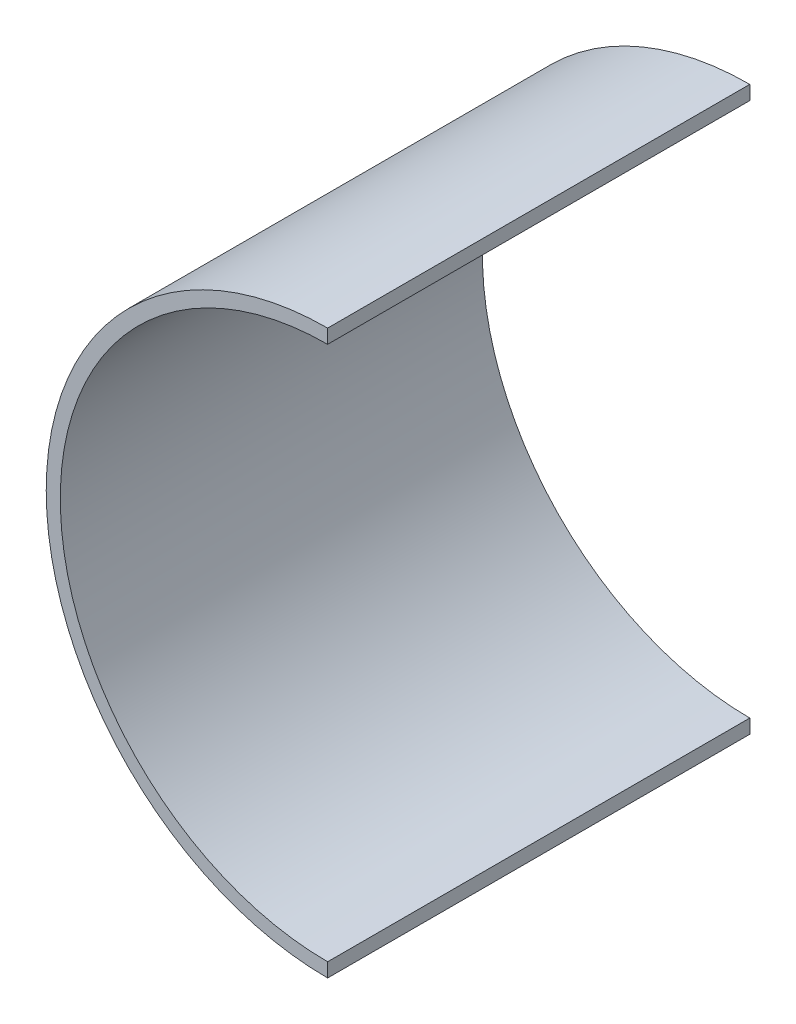
ISO-10303-21;
HEADER;
FILE_DESCRIPTION(('STEP AP214'),'2;1');
FILE_NAME('part.step','',(''),(''),'','','');
FILE_SCHEMA(('AUTOMOTIVE_DESIGN { 1 0 10303 214 1 1 1 1 }'));
ENDSEC;
DATA;
#1=APPLICATION_CONTEXT('core data for automotive mechanical design processes');
#2=APPLICATION_PROTOCOL_DEFINITION('international standard','automotive_design',2000,#1);
#3=PRODUCT_CONTEXT('',#1,'mechanical');
#4=PRODUCT('Part','Part','',(#3));
#5=PRODUCT_RELATED_PRODUCT_CATEGORY('part','',(#4));
#6=PRODUCT_DEFINITION_FORMATION('','',#4);
#7=PRODUCT_DEFINITION_CONTEXT('part definition',#1,'design');
#8=PRODUCT_DEFINITION('design','',#6,#7);
#9=PRODUCT_DEFINITION_SHAPE('','',#8);
#10=(LENGTH_UNIT() NAMED_UNIT(*) SI_UNIT(.MILLI.,.METRE.));
#11=(NAMED_UNIT(*) PLANE_ANGLE_UNIT() SI_UNIT($,.RADIAN.));
#12=(NAMED_UNIT(*) SI_UNIT($,.STERADIAN.) SOLID_ANGLE_UNIT());
#13=UNCERTAINTY_MEASURE_WITH_UNIT(LENGTH_MEASURE(1.E-05),#10,'distance_accuracy_value','');
#14=(GEOMETRIC_REPRESENTATION_CONTEXT(3) GLOBAL_UNCERTAINTY_ASSIGNED_CONTEXT((#13)) GLOBAL_UNIT_ASSIGNED_CONTEXT((#10,
#11,#12)) REPRESENTATION_CONTEXT('',''));
#15=CARTESIAN_POINT('',(0.,0.,0.));
#16=DIRECTION('',(0.,0.,1.));
#17=DIRECTION('',(1.,0.,0.));
#18=AXIS2_PLACEMENT_3D('',#15,#16,#17);
#19=CARTESIAN_POINT('',(0.,0.,20.));
#20=DIRECTION('',(0.,0.,-1.));
#21=DIRECTION('',(-1.,0.,0.));
#22=AXIS2_PLACEMENT_3D('',#19,#20,#21);
#23=CYLINDRICAL_SURFACE('',#22,38.);
#24=CARTESIAN_POINT('',(0.,0.,0.));
#25=DIRECTION('',(0.,0.,1.));
#26=DIRECTION('',(1.,0.,0.));
#27=AXIS2_PLACEMENT_3D('',#24,#25,#26);
#28=CIRCLE('',#27,38.);
#29=CARTESIAN_POINT('',(0.,38.,0.));
#30=VERTEX_POINT('',#29);
#31=CARTESIAN_POINT('',(0.,-38.,0.));
#32=VERTEX_POINT('',#31);
#33=EDGE_CURVE('E84',#30,#32,#28,.T.);
#34=ORIENTED_EDGE('',*,*,#33,.F.);
#35=DIRECTION('',(0.,0.,-1.));
#36=VECTOR('',#35,1.);
#37=CARTESIAN_POINT('',(0.,38.,20.));
#38=LINE('',#37,#36);
#39=CARTESIAN_POINT('',(0.,38.,60.));
#40=VERTEX_POINT('',#39);
#41=EDGE_CURVE('E11',#40,#30,#38,.T.);
#42=ORIENTED_EDGE('',*,*,#41,.F.);
#43=CARTESIAN_POINT('',(0.,0.,60.));
#44=DIRECTION('',(0.,0.,-1.));
#45=DIRECTION('',(1.,0.,0.));
#46=AXIS2_PLACEMENT_3D('',#43,#44,#45);
#47=CIRCLE('',#46,38.);
#48=CARTESIAN_POINT('',(0.,-38.,60.));
#49=VERTEX_POINT('',#48);
#50=EDGE_CURVE('E83',#49,#40,#47,.T.);
#51=ORIENTED_EDGE('',*,*,#50,.F.);
#52=DIRECTION('',(0.,0.,-1.));
#53=VECTOR('',#52,1.);
#54=CARTESIAN_POINT('',(0.,-38.,20.));
#55=LINE('',#54,#53);
#56=EDGE_CURVE('E57',#49,#32,#55,.T.);
#57=ORIENTED_EDGE('',*,*,#56,.T.);
#58=EDGE_LOOP('',(#34,#42,#51,#57));
#59=FACE_BOUND('',#58,.T.);
#60=ADVANCED_FACE('F43',(#59),#23,.F.);
#61=CARTESIAN_POINT('',(0.,0.,20.));
#62=DIRECTION('',(1.,0.,0.));
#63=DIRECTION('',(0.,0.,-1.));
#64=AXIS2_PLACEMENT_3D('',#61,#62,#63);
#65=PLANE('',#64);
#66=DIRECTION('',(0.,-1.,0.));
#67=VECTOR('',#66,1.);
#68=CARTESIAN_POINT('',(0.,0.,0.));
#69=LINE('',#68,#67);
#70=CARTESIAN_POINT('',(0.,40.,0.));
#71=VERTEX_POINT('',#70);
#72=EDGE_CURVE('E104',#71,#30,#69,.T.);
#73=ORIENTED_EDGE('',*,*,#72,.F.);
#74=DIRECTION('',(0.,0.,-1.));
#75=VECTOR('',#74,1.);
#76=CARTESIAN_POINT('',(0.,40.,20.));
#77=LINE('',#76,#75);
#78=CARTESIAN_POINT('',(0.,40.,60.));
#79=VERTEX_POINT('',#78);
#80=EDGE_CURVE('E50',#79,#71,#77,.T.);
#81=ORIENTED_EDGE('',*,*,#80,.F.);
#82=DIRECTION('',(0.,1.,0.));
#83=VECTOR('',#82,1.);
#84=CARTESIAN_POINT('',(0.,40.,60.));
#85=LINE('',#84,#83);
#86=EDGE_CURVE('E89',#40,#79,#85,.T.);
#87=ORIENTED_EDGE('',*,*,#86,.F.);
#88=ORIENTED_EDGE('',*,*,#41,.T.);
#89=EDGE_LOOP('',(#73,#81,#87,#88));
#90=FACE_BOUND('',#89,.T.);
#91=ADVANCED_FACE('F90',(#90),#65,.T.);
#92=CARTESIAN_POINT('',(0.,0.,20.));
#93=DIRECTION('',(0.,0.,-1.));
#94=DIRECTION('',(-1.,0.,0.));
#95=AXIS2_PLACEMENT_3D('',#92,#93,#94);
#96=CYLINDRICAL_SURFACE('',#95,40.);
#97=CARTESIAN_POINT('',(0.,0.,0.));
#98=DIRECTION('',(0.,0.,1.));
#99=DIRECTION('',(1.,0.,0.));
#100=AXIS2_PLACEMENT_3D('',#97,#98,#99);
#101=CIRCLE('',#100,40.);
#102=CARTESIAN_POINT('',(0.,-40.,0.));
#103=VERTEX_POINT('',#102);
#104=EDGE_CURVE('E106',#71,#103,#101,.T.);
#105=ORIENTED_EDGE('',*,*,#104,.T.);
#106=DIRECTION('',(0.,0.,-1.));
#107=VECTOR('',#106,1.);
#108=CARTESIAN_POINT('',(0.,-40.,20.));
#109=LINE('',#108,#107);
#110=CARTESIAN_POINT('',(0.,-40.,60.));
#111=VERTEX_POINT('',#110);
#112=EDGE_CURVE('E65',#111,#103,#109,.T.);
#113=ORIENTED_EDGE('',*,*,#112,.F.);
#114=CARTESIAN_POINT('',(0.,0.,60.));
#115=DIRECTION('',(0.,0.,1.));
#116=DIRECTION('',(1.,0.,0.));
#117=AXIS2_PLACEMENT_3D('',#114,#115,#116);
#118=CIRCLE('',#117,40.);
#119=EDGE_CURVE('E94',#79,#111,#118,.T.);
#120=ORIENTED_EDGE('',*,*,#119,.F.);
#121=ORIENTED_EDGE('',*,*,#80,.T.);
#122=EDGE_LOOP('',(#105,#113,#120,#121));
#123=FACE_BOUND('',#122,.T.);
#124=ADVANCED_FACE('F112',(#123),#96,.T.);
#125=EDGE_CURVE('E107',#32,#103,#69,.T.);
#126=ORIENTED_EDGE('',*,*,#125,.F.);
#127=ORIENTED_EDGE('',*,*,#56,.F.);
#128=DIRECTION('',(0.,1.,0.));
#129=VECTOR('',#128,1.);
#130=CARTESIAN_POINT('',(0.,-38.,60.));
#131=LINE('',#130,#129);
#132=EDGE_CURVE('E98',#111,#49,#131,.T.);
#133=ORIENTED_EDGE('',*,*,#132,.F.);
#134=ORIENTED_EDGE('',*,*,#112,.T.);
#135=EDGE_LOOP('',(#126,#127,#133,#134));
#136=FACE_BOUND('',#135,.T.);
#137=ADVANCED_FACE('F116',(#136),#65,.T.);
#138=CARTESIAN_POINT('',(0.,0.,0.));
#139=DIRECTION('',(0.,0.,1.));
#140=DIRECTION('',(1.,0.,0.));
#141=AXIS2_PLACEMENT_3D('',#138,#139,#140);
#142=PLANE('',#141);
#143=ORIENTED_EDGE('',*,*,#33,.T.);
#144=ORIENTED_EDGE('',*,*,#125,.T.);
#145=ORIENTED_EDGE('',*,*,#104,.F.);
#146=ORIENTED_EDGE('',*,*,#72,.T.);
#147=EDGE_LOOP('',(#143,#144,#145,#146));
#148=FACE_BOUND('',#147,.T.);
#149=ADVANCED_FACE('F115',(#148),#142,.F.);
#150=CARTESIAN_POINT('',(0.,0.,60.));
#151=DIRECTION('',(0.,0.,1.));
#152=DIRECTION('',(1.,0.,0.));
#153=AXIS2_PLACEMENT_3D('',#150,#151,#152);
#154=PLANE('',#153);
#155=ORIENTED_EDGE('',*,*,#50,.T.);
#156=ORIENTED_EDGE('',*,*,#86,.T.);
#157=ORIENTED_EDGE('',*,*,#119,.T.);
#158=ORIENTED_EDGE('',*,*,#132,.T.);
#159=EDGE_LOOP('',(#155,#156,#157,#158));
#160=FACE_BOUND('',#159,.T.);
#161=ADVANCED_FACE('F97',(#160),#154,.T.);
#162=CLOSED_SHELL('',(#60,#91,#124,#137,#149,#161));
#163=MANIFOLD_SOLID_BREP('B2',#162);
#164=ADVANCED_BREP_SHAPE_REPRESENTATION('',(#18,#163),#14);
#165=SHAPE_DEFINITION_REPRESENTATION(#9,#164);
ENDSEC;
END-ISO-10303-21;
